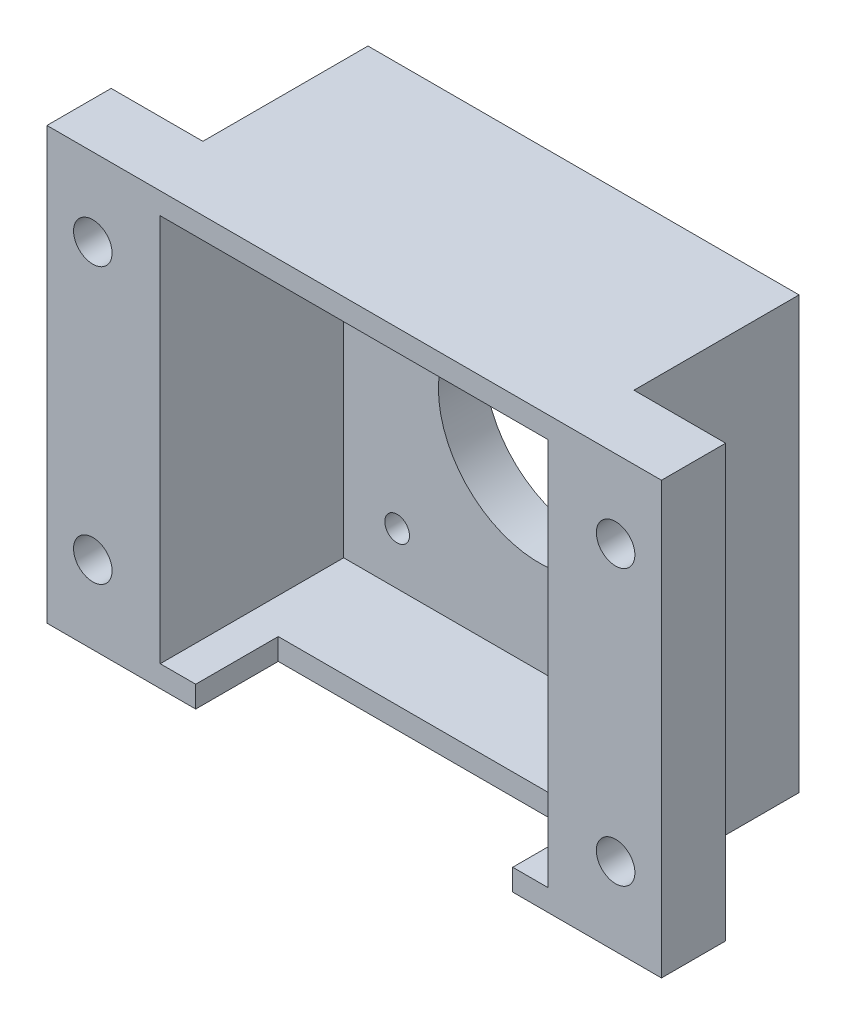
ISO-10303-21;
HEADER;
FILE_DESCRIPTION(('STEP AP214'),'2;1');
FILE_NAME('part.step','',(''),(''),'','','');
FILE_SCHEMA(('AUTOMOTIVE_DESIGN { 1 0 10303 214 1 1 1 1 }'));
ENDSEC;
DATA;
#1=APPLICATION_CONTEXT('core data for automotive mechanical design processes');
#2=APPLICATION_PROTOCOL_DEFINITION('international standard','automotive_design',2000,#1);
#3=PRODUCT_CONTEXT('',#1,'mechanical');
#4=PRODUCT('Part','Part','',(#3));
#5=PRODUCT_RELATED_PRODUCT_CATEGORY('part','',(#4));
#6=PRODUCT_DEFINITION_FORMATION('','',#4);
#7=PRODUCT_DEFINITION_CONTEXT('part definition',#1,'design');
#8=PRODUCT_DEFINITION('design','',#6,#7);
#9=PRODUCT_DEFINITION_SHAPE('','',#8);
#10=(LENGTH_UNIT() NAMED_UNIT(*) SI_UNIT(.MILLI.,.METRE.));
#11=(NAMED_UNIT(*) PLANE_ANGLE_UNIT() SI_UNIT($,.RADIAN.));
#12=(NAMED_UNIT(*) SI_UNIT($,.STERADIAN.) SOLID_ANGLE_UNIT());
#13=UNCERTAINTY_MEASURE_WITH_UNIT(LENGTH_MEASURE(1.E-05),#10,'distance_accuracy_value','');
#14=(GEOMETRIC_REPRESENTATION_CONTEXT(3) GLOBAL_UNCERTAINTY_ASSIGNED_CONTEXT((#13)) GLOBAL_UNIT_ASSIGNED_CONTEXT((#10,
#11,#12)) REPRESENTATION_CONTEXT('',''));
#15=CARTESIAN_POINT('',(0.,0.,0.));
#16=DIRECTION('',(0.,0.,1.));
#17=DIRECTION('',(1.,0.,0.));
#18=AXIS2_PLACEMENT_3D('',#15,#16,#17);
#19=CARTESIAN_POINT('',(23.5,-23.5,53.));
#20=DIRECTION('',(-1.,0.,0.));
#21=DIRECTION('',(0.,0.,1.));
#22=AXIS2_PLACEMENT_3D('',#19,#20,#21);
#23=PLANE('',#22);
#24=DIRECTION('',(0.,0.,-1.));
#25=VECTOR('',#24,1.);
#26=CARTESIAN_POINT('',(23.5,23.5,53.));
#27=LINE('',#26,#25);
#28=CARTESIAN_POINT('',(23.5,23.5,18.));
#29=VERTEX_POINT('',#28);
#30=CARTESIAN_POINT('',(23.5,23.5,0.));
#31=VERTEX_POINT('',#30);
#32=EDGE_CURVE('E50',#29,#31,#27,.T.);
#33=ORIENTED_EDGE('',*,*,#32,.F.);
#34=DIRECTION('',(0.,-1.,0.));
#35=VECTOR('',#34,1.);
#36=CARTESIAN_POINT('',(23.5,23.5,18.));
#37=LINE('',#36,#35);
#38=CARTESIAN_POINT('',(23.5,-23.5,18.));
#39=VERTEX_POINT('',#38);
#40=EDGE_CURVE('E291',#29,#39,#37,.T.);
#41=ORIENTED_EDGE('',*,*,#40,.T.);
#42=DIRECTION('',(0.,0.,-1.));
#43=VECTOR('',#42,1.);
#44=CARTESIAN_POINT('',(23.5,-23.5,53.));
#45=LINE('',#44,#43);
#46=CARTESIAN_POINT('',(23.5,-23.5,0.));
#47=VERTEX_POINT('',#46);
#48=EDGE_CURVE('E247',#39,#47,#45,.T.);
#49=ORIENTED_EDGE('',*,*,#48,.T.);
#50=DIRECTION('',(0.,1.,0.));
#51=VECTOR('',#50,1.);
#52=CARTESIAN_POINT('',(23.5,-23.5,0.));
#53=LINE('',#52,#51);
#54=EDGE_CURVE('E227',#47,#31,#53,.T.);
#55=ORIENTED_EDGE('',*,*,#54,.T.);
#56=EDGE_LOOP('',(#33,#41,#49,#55));
#57=FACE_BOUND('',#56,.T.);
#58=ADVANCED_FACE('F43',(#57),#23,.F.);
#59=CARTESIAN_POINT('',(-23.5,23.5,53.));
#60=DIRECTION('',(0.,-1.,0.));
#61=DIRECTION('',(0.,0.,-1.));
#62=AXIS2_PLACEMENT_3D('',#59,#60,#61);
#63=PLANE('',#62);
#64=DIRECTION('',(0.,0.,-1.));
#65=VECTOR('',#64,1.);
#66=CARTESIAN_POINT('',(-23.5,23.5,53.));
#67=LINE('',#66,#65);
#68=CARTESIAN_POINT('',(-23.5,23.5,18.));
#69=VERTEX_POINT('',#68);
#70=CARTESIAN_POINT('',(-23.5,23.5,0.));
#71=VERTEX_POINT('',#70);
#72=EDGE_CURVE('E251',#69,#71,#67,.T.);
#73=ORIENTED_EDGE('',*,*,#72,.F.);
#74=DIRECTION('',(-1.,0.,0.));
#75=VECTOR('',#74,1.);
#76=CARTESIAN_POINT('',(-23.5,23.5,18.));
#77=LINE('',#76,#75);
#78=CARTESIAN_POINT('',(-33.5,23.5,18.));
#79=VERTEX_POINT('',#78);
#80=EDGE_CURVE('E308',#69,#79,#77,.T.);
#81=ORIENTED_EDGE('',*,*,#80,.T.);
#82=DIRECTION('',(0.,0.,1.));
#83=VECTOR('',#82,1.);
#84=CARTESIAN_POINT('',(-33.5,23.5,18.));
#85=LINE('',#84,#83);
#86=CARTESIAN_POINT('',(-33.5,23.5,25.));
#87=VERTEX_POINT('',#86);
#88=EDGE_CURVE('E309',#79,#87,#85,.T.);
#89=ORIENTED_EDGE('',*,*,#88,.T.);
#90=DIRECTION('',(1.,0.,0.));
#91=VECTOR('',#90,1.);
#92=CARTESIAN_POINT('',(-24.,23.5,25.));
#93=LINE('',#92,#91);
#94=CARTESIAN_POINT('',(33.5,23.5,25.));
#95=VERTEX_POINT('',#94);
#96=EDGE_CURVE('E326',#87,#95,#93,.T.);
#97=ORIENTED_EDGE('',*,*,#96,.T.);
#98=DIRECTION('',(0.,0.,1.));
#99=VECTOR('',#98,1.);
#100=CARTESIAN_POINT('',(33.5,23.5,18.));
#101=LINE('',#100,#99);
#102=CARTESIAN_POINT('',(33.5,23.5,18.));
#103=VERTEX_POINT('',#102);
#104=EDGE_CURVE('E577',#103,#95,#101,.T.);
#105=ORIENTED_EDGE('',*,*,#104,.F.);
#106=DIRECTION('',(-1.,0.,0.));
#107=VECTOR('',#106,1.);
#108=CARTESIAN_POINT('',(23.5,23.5,18.));
#109=LINE('',#108,#107);
#110=EDGE_CURVE('E298',#103,#29,#109,.T.);
#111=ORIENTED_EDGE('',*,*,#110,.T.);
#112=ORIENTED_EDGE('',*,*,#32,.T.);
#113=DIRECTION('',(-1.,0.,0.));
#114=VECTOR('',#113,1.);
#115=CARTESIAN_POINT('',(-23.5,23.5,0.));
#116=LINE('',#115,#114);
#117=EDGE_CURVE('E238',#31,#71,#116,.T.);
#118=ORIENTED_EDGE('',*,*,#117,.T.);
#119=EDGE_LOOP('',(#73,#81,#89,#97,#105,#111,#112,#118));
#120=FACE_BOUND('',#119,.T.);
#121=ADVANCED_FACE('F283',(#120),#63,.F.);
#122=CARTESIAN_POINT('',(-23.5,-23.5,53.));
#123=DIRECTION('',(1.,0.,0.));
#124=DIRECTION('',(0.,0.,-1.));
#125=AXIS2_PLACEMENT_3D('',#122,#123,#124);
#126=PLANE('',#125);
#127=DIRECTION('',(0.,0.,-1.));
#128=VECTOR('',#127,1.);
#129=CARTESIAN_POINT('',(-23.5,-23.5,53.));
#130=LINE('',#129,#128);
#131=CARTESIAN_POINT('',(-23.5,-23.5,18.));
#132=VERTEX_POINT('',#131);
#133=CARTESIAN_POINT('',(-23.5,-23.5,0.));
#134=VERTEX_POINT('',#133);
#135=EDGE_CURVE('E249',#132,#134,#130,.T.);
#136=ORIENTED_EDGE('',*,*,#135,.F.);
#137=DIRECTION('',(0.,1.,0.));
#138=VECTOR('',#137,1.);
#139=CARTESIAN_POINT('',(-23.5,23.5,18.));
#140=LINE('',#139,#138);
#141=EDGE_CURVE('E305',#132,#69,#140,.T.);
#142=ORIENTED_EDGE('',*,*,#141,.T.);
#143=ORIENTED_EDGE('',*,*,#72,.T.);
#144=DIRECTION('',(0.,-1.,0.));
#145=VECTOR('',#144,1.);
#146=CARTESIAN_POINT('',(-23.5,-23.5,0.));
#147=LINE('',#146,#145);
#148=EDGE_CURVE('E241',#71,#134,#147,.T.);
#149=ORIENTED_EDGE('',*,*,#148,.T.);
#150=EDGE_LOOP('',(#136,#142,#143,#149));
#151=FACE_BOUND('',#150,.T.);
#152=ADVANCED_FACE('F288',(#151),#126,.F.);
#153=CARTESIAN_POINT('',(-23.5,-23.5,53.));
#154=DIRECTION('',(0.,1.,0.));
#155=DIRECTION('',(0.,0.,1.));
#156=AXIS2_PLACEMENT_3D('',#153,#154,#155);
#157=PLANE('',#156);
#158=DIRECTION('',(-1.,0.,0.));
#159=VECTOR('',#158,1.);
#160=CARTESIAN_POINT('',(-23.5,-23.5,25.));
#161=LINE('',#160,#159);
#162=CARTESIAN_POINT('',(33.5,-23.5,25.));
#163=VERTEX_POINT('',#162);
#164=CARTESIAN_POINT('',(17.2818011395303,-23.5,25.));
#165=VERTEX_POINT('',#164);
#166=EDGE_CURVE('E175',#163,#165,#161,.T.);
#167=ORIENTED_EDGE('',*,*,#166,.T.);
#168=DIRECTION('',(0.,0.,1.));
#169=VECTOR('',#168,1.);
#170=CARTESIAN_POINT('',(17.2818011395303,-23.5,25.));
#171=LINE('',#170,#169);
#172=CARTESIAN_POINT('',(17.2818011395303,-23.5,16.));
#173=VERTEX_POINT('',#172);
#174=EDGE_CURVE('E157',#173,#165,#171,.T.);
#175=ORIENTED_EDGE('',*,*,#174,.F.);
#176=DIRECTION('',(1.,0.,0.));
#177=VECTOR('',#176,1.);
#178=CARTESIAN_POINT('',(-17.2818011395303,-23.5,16.));
#179=LINE('',#178,#177);
#180=CARTESIAN_POINT('',(-17.2818011395303,-23.5,16.));
#181=VERTEX_POINT('',#180);
#182=EDGE_CURVE('E180',#181,#173,#179,.T.);
#183=ORIENTED_EDGE('',*,*,#182,.F.);
#184=DIRECTION('',(0.,0.,-1.));
#185=VECTOR('',#184,1.);
#186=CARTESIAN_POINT('',(-17.2818011395303,-23.5,25.));
#187=LINE('',#186,#185);
#188=CARTESIAN_POINT('',(-17.2818011395303,-23.5,25.));
#189=VERTEX_POINT('',#188);
#190=EDGE_CURVE('E168',#189,#181,#187,.T.);
#191=ORIENTED_EDGE('',*,*,#190,.F.);
#192=CARTESIAN_POINT('',(-33.5,-23.5,25.));
#193=VERTEX_POINT('',#192);
#194=EDGE_CURVE('E186',#189,#193,#161,.T.);
#195=ORIENTED_EDGE('',*,*,#194,.T.);
#196=DIRECTION('',(0.,0.,1.));
#197=VECTOR('',#196,1.);
#198=CARTESIAN_POINT('',(-33.5,-23.5,18.));
#199=LINE('',#198,#197);
#200=CARTESIAN_POINT('',(-33.5,-23.5,18.));
#201=VERTEX_POINT('',#200);
#202=EDGE_CURVE('E313',#201,#193,#199,.T.);
#203=ORIENTED_EDGE('',*,*,#202,.F.);
#204=DIRECTION('',(1.,0.,0.));
#205=VECTOR('',#204,1.);
#206=CARTESIAN_POINT('',(-23.5,-23.5,18.));
#207=LINE('',#206,#205);
#208=EDGE_CURVE('E317',#201,#132,#207,.T.);
#209=ORIENTED_EDGE('',*,*,#208,.T.);
#210=ORIENTED_EDGE('',*,*,#135,.T.);
#211=DIRECTION('',(1.,0.,0.));
#212=VECTOR('',#211,1.);
#213=CARTESIAN_POINT('',(-23.5,-23.5,0.));
#214=LINE('',#213,#212);
#215=EDGE_CURVE('E244',#134,#47,#214,.T.);
#216=ORIENTED_EDGE('',*,*,#215,.T.);
#217=ORIENTED_EDGE('',*,*,#48,.F.);
#218=DIRECTION('',(1.,0.,0.));
#219=VECTOR('',#218,1.);
#220=CARTESIAN_POINT('',(23.5,-23.5,18.));
#221=LINE('',#220,#219);
#222=CARTESIAN_POINT('',(33.5,-23.5,18.));
#223=VERTEX_POINT('',#222);
#224=EDGE_CURVE('E65',#39,#223,#221,.T.);
#225=ORIENTED_EDGE('',*,*,#224,.T.);
#226=DIRECTION('',(0.,0.,1.));
#227=VECTOR('',#226,1.);
#228=CARTESIAN_POINT('',(33.5,-23.5,18.));
#229=LINE('',#228,#227);
#230=EDGE_CURVE('E183',#223,#163,#229,.T.);
#231=ORIENTED_EDGE('',*,*,#230,.T.);
#232=EDGE_LOOP('',(#167,#175,#183,#191,#195,#203,#209,#210,#216,#217,#225,#231));
#233=FACE_BOUND('',#232,.T.);
#234=ADVANCED_FACE('F182',(#233),#157,.F.);
#235=CARTESIAN_POINT('',(0.,0.,0.));
#236=DIRECTION('',(0.,0.,-1.));
#237=DIRECTION('',(-1.,0.,0.));
#238=AXIS2_PLACEMENT_3D('',#235,#236,#237);
#239=PLANE('',#238);
#240=CARTESIAN_POINT('',(-15.321257734351,-15.4773506253541,0.));
#241=DIRECTION('',(0.,0.,1.));
#242=DIRECTION('',(-1.,0.,0.));
#243=AXIS2_PLACEMENT_3D('',#240,#241,#242);
#244=CIRCLE('',#243,1.35);
#245=CARTESIAN_POINT('',(-16.671257734351,-15.4773506253541,0.));
#246=VERTEX_POINT('',#245);
#247=EDGE_CURVE('E185',#246,#246,#244,.T.);
#248=ORIENTED_EDGE('',*,*,#247,.T.);
#249=EDGE_LOOP('',(#248));
#250=FACE_BOUND('',#249,.T.);
#251=CARTESIAN_POINT('',(15.678742265649,-15.4773506253541,0.));
#252=DIRECTION('',(0.,0.,1.));
#253=DIRECTION('',(1.,0.,0.));
#254=AXIS2_PLACEMENT_3D('',#251,#252,#253);
#255=CIRCLE('',#254,1.35);
#256=CARTESIAN_POINT('',(17.028742265649,-15.4773506253541,0.));
#257=VERTEX_POINT('',#256);
#258=EDGE_CURVE('E195',#257,#257,#255,.T.);
#259=ORIENTED_EDGE('',*,*,#258,.T.);
#260=EDGE_LOOP('',(#259));
#261=FACE_BOUND('',#260,.T.);
#262=CARTESIAN_POINT('',(15.678742265649,15.5226493746459,0.));
#263=DIRECTION('',(0.,0.,1.));
#264=DIRECTION('',(-1.,0.,0.));
#265=AXIS2_PLACEMENT_3D('',#262,#263,#264);
#266=CIRCLE('',#265,1.35);
#267=CARTESIAN_POINT('',(14.328742265649,15.5226493746459,0.));
#268=VERTEX_POINT('',#267);
#269=EDGE_CURVE('E199',#268,#268,#266,.T.);
#270=ORIENTED_EDGE('',*,*,#269,.T.);
#271=EDGE_LOOP('',(#270));
#272=FACE_BOUND('',#271,.T.);
#273=CARTESIAN_POINT('',(-15.321257734351,15.5226493746459,0.));
#274=DIRECTION('',(0.,0.,1.));
#275=DIRECTION('',(1.,0.,0.));
#276=AXIS2_PLACEMENT_3D('',#273,#274,#275);
#277=CIRCLE('',#276,1.35);
#278=CARTESIAN_POINT('',(-13.971257734351,15.5226493746459,0.));
#279=VERTEX_POINT('',#278);
#280=EDGE_CURVE('E203',#279,#279,#277,.T.);
#281=ORIENTED_EDGE('',*,*,#280,.T.);
#282=EDGE_LOOP('',(#281));
#283=FACE_BOUND('',#282,.T.);
#284=CARTESIAN_POINT('',(0.178742265649005,0.0226493746458712,0.));
#285=DIRECTION('',(0.,0.,1.));
#286=DIRECTION('',(1.,0.,0.));
#287=AXIS2_PLACEMENT_3D('',#284,#285,#286);
#288=CIRCLE('',#287,11.);
#289=CARTESIAN_POINT('',(11.178742265649,0.0226493746458712,0.));
#290=VERTEX_POINT('',#289);
#291=EDGE_CURVE('E207',#290,#290,#288,.T.);
#292=ORIENTED_EDGE('',*,*,#291,.T.);
#293=EDGE_LOOP('',(#292));
#294=FACE_BOUND('',#293,.T.);
#295=ORIENTED_EDGE('',*,*,#54,.F.);
#296=ORIENTED_EDGE('',*,*,#215,.F.);
#297=ORIENTED_EDGE('',*,*,#148,.F.);
#298=ORIENTED_EDGE('',*,*,#117,.F.);
#299=EDGE_LOOP('',(#295,#296,#297,#298));
#300=FACE_BOUND('',#299,.T.);
#301=ADVANCED_FACE('F300',(#250,#261,#272,#283,#294,#300),#239,.T.);
#302=CARTESIAN_POINT('',(21.15,-21.15,5.));
#303=DIRECTION('',(1.,0.,0.));
#304=DIRECTION('',(0.,0.,-1.));
#305=AXIS2_PLACEMENT_3D('',#302,#303,#304);
#306=PLANE('',#305);
#307=DIRECTION('',(0.,0.,1.));
#308=VECTOR('',#307,1.);
#309=CARTESIAN_POINT('',(21.15,-21.15,5.));
#310=LINE('',#309,#308);
#311=CARTESIAN_POINT('',(21.15,-21.15,5.));
#312=VERTEX_POINT('',#311);
#313=CARTESIAN_POINT('',(21.15,-21.15,25.));
#314=VERTEX_POINT('',#313);
#315=EDGE_CURVE('E224',#312,#314,#310,.T.);
#316=ORIENTED_EDGE('',*,*,#315,.T.);
#317=DIRECTION('',(0.,1.,0.));
#318=VECTOR('',#317,1.);
#319=CARTESIAN_POINT('',(21.15,-21.15,25.));
#320=LINE('',#319,#318);
#321=CARTESIAN_POINT('',(21.15,21.15,25.));
#322=VERTEX_POINT('',#321);
#323=EDGE_CURVE('E191',#314,#322,#320,.T.);
#324=ORIENTED_EDGE('',*,*,#323,.T.);
#325=DIRECTION('',(0.,0.,1.));
#326=VECTOR('',#325,1.);
#327=CARTESIAN_POINT('',(21.15,21.15,5.));
#328=LINE('',#327,#326);
#329=CARTESIAN_POINT('',(21.15,21.15,5.));
#330=VERTEX_POINT('',#329);
#331=EDGE_CURVE('E223',#330,#322,#328,.T.);
#332=ORIENTED_EDGE('',*,*,#331,.F.);
#333=DIRECTION('',(0.,1.,0.));
#334=VECTOR('',#333,1.);
#335=CARTESIAN_POINT('',(21.15,-21.15,5.));
#336=LINE('',#335,#334);
#337=EDGE_CURVE('E211',#312,#330,#336,.T.);
#338=ORIENTED_EDGE('',*,*,#337,.F.);
#339=EDGE_LOOP('',(#316,#324,#332,#338));
#340=FACE_BOUND('',#339,.T.);
#341=ADVANCED_FACE('F341',(#340),#306,.F.);
#342=CARTESIAN_POINT('',(-21.15,-21.15,5.));
#343=DIRECTION('',(0.,-1.,0.));
#344=DIRECTION('',(0.,0.,-1.));
#345=AXIS2_PLACEMENT_3D('',#342,#343,#344);
#346=PLANE('',#345);
#347=DIRECTION('',(-1.,0.,0.));
#348=VECTOR('',#347,1.);
#349=CARTESIAN_POINT('',(-17.2818011395303,-21.15,16.));
#350=LINE('',#349,#348);
#351=CARTESIAN_POINT('',(17.2818011395303,-21.15,16.));
#352=VERTEX_POINT('',#351);
#353=CARTESIAN_POINT('',(-17.2818011395303,-21.15,16.));
#354=VERTEX_POINT('',#353);
#355=EDGE_CURVE('E568',#352,#354,#350,.T.);
#356=ORIENTED_EDGE('',*,*,#355,.F.);
#357=DIRECTION('',(0.,0.,-1.));
#358=VECTOR('',#357,1.);
#359=CARTESIAN_POINT('',(17.2818011395303,-21.15,25.));
#360=LINE('',#359,#358);
#361=CARTESIAN_POINT('',(17.2818011395303,-21.15,25.));
#362=VERTEX_POINT('',#361);
#363=EDGE_CURVE('E339',#362,#352,#360,.T.);
#364=ORIENTED_EDGE('',*,*,#363,.F.);
#365=DIRECTION('',(1.,0.,0.));
#366=VECTOR('',#365,1.);
#367=CARTESIAN_POINT('',(-21.15,-21.15,25.));
#368=LINE('',#367,#366);
#369=EDGE_CURVE('E178',#362,#314,#368,.T.);
#370=ORIENTED_EDGE('',*,*,#369,.T.);
#371=ORIENTED_EDGE('',*,*,#315,.F.);
#372=DIRECTION('',(1.,0.,0.));
#373=VECTOR('',#372,1.);
#374=CARTESIAN_POINT('',(-21.15,-21.15,5.));
#375=LINE('',#374,#373);
#376=CARTESIAN_POINT('',(-21.15,-21.15,5.));
#377=VERTEX_POINT('',#376);
#378=EDGE_CURVE('E220',#377,#312,#375,.T.);
#379=ORIENTED_EDGE('',*,*,#378,.F.);
#380=DIRECTION('',(0.,0.,1.));
#381=VECTOR('',#380,1.);
#382=CARTESIAN_POINT('',(-21.15,-21.15,5.));
#383=LINE('',#382,#381);
#384=CARTESIAN_POINT('',(-21.15,-21.15,25.));
#385=VERTEX_POINT('',#384);
#386=EDGE_CURVE('E228',#377,#385,#383,.T.);
#387=ORIENTED_EDGE('',*,*,#386,.T.);
#388=CARTESIAN_POINT('',(-17.2818011395303,-21.15,25.));
#389=VERTEX_POINT('',#388);
#390=EDGE_CURVE('E331',#385,#389,#368,.T.);
#391=ORIENTED_EDGE('',*,*,#390,.T.);
#392=DIRECTION('',(0.,0.,1.));
#393=VECTOR('',#392,1.);
#394=CARTESIAN_POINT('',(-17.2818011395303,-21.15,25.));
#395=LINE('',#394,#393);
#396=EDGE_CURVE('E57',#354,#389,#395,.T.);
#397=ORIENTED_EDGE('',*,*,#396,.F.);
#398=EDGE_LOOP('',(#356,#364,#370,#371,#379,#387,#391,#397));
#399=FACE_BOUND('',#398,.T.);
#400=ADVANCED_FACE('F336',(#399),#346,.F.);
#401=CARTESIAN_POINT('',(-21.15,-21.15,5.));
#402=DIRECTION('',(-1.,0.,0.));
#403=DIRECTION('',(0.,0.,1.));
#404=AXIS2_PLACEMENT_3D('',#401,#402,#403);
#405=PLANE('',#404);
#406=DIRECTION('',(0.,0.,1.));
#407=VECTOR('',#406,1.);
#408=CARTESIAN_POINT('',(-21.15,21.15,5.));
#409=LINE('',#408,#407);
#410=CARTESIAN_POINT('',(-21.15,21.15,5.));
#411=VERTEX_POINT('',#410);
#412=CARTESIAN_POINT('',(-21.15,21.15,25.));
#413=VERTEX_POINT('',#412);
#414=EDGE_CURVE('E231',#411,#413,#409,.T.);
#415=ORIENTED_EDGE('',*,*,#414,.T.);
#416=DIRECTION('',(0.,-1.,0.));
#417=VECTOR('',#416,1.);
#418=CARTESIAN_POINT('',(-21.15,-21.15,25.));
#419=LINE('',#418,#417);
#420=EDGE_CURVE('E329',#413,#385,#419,.T.);
#421=ORIENTED_EDGE('',*,*,#420,.T.);
#422=ORIENTED_EDGE('',*,*,#386,.F.);
#423=DIRECTION('',(0.,-1.,0.));
#424=VECTOR('',#423,1.);
#425=CARTESIAN_POINT('',(-21.15,-21.15,5.));
#426=LINE('',#425,#424);
#427=EDGE_CURVE('E217',#411,#377,#426,.T.);
#428=ORIENTED_EDGE('',*,*,#427,.F.);
#429=EDGE_LOOP('',(#415,#421,#422,#428));
#430=FACE_BOUND('',#429,.T.);
#431=ADVANCED_FACE('F346',(#430),#405,.F.);
#432=CARTESIAN_POINT('',(-21.15,21.15,5.));
#433=DIRECTION('',(0.,1.,0.));
#434=DIRECTION('',(0.,0.,1.));
#435=AXIS2_PLACEMENT_3D('',#432,#433,#434);
#436=PLANE('',#435);
#437=ORIENTED_EDGE('',*,*,#331,.T.);
#438=DIRECTION('',(-1.,0.,0.));
#439=VECTOR('',#438,1.);
#440=CARTESIAN_POINT('',(-21.15,21.15,25.));
#441=LINE('',#440,#439);
#442=EDGE_CURVE('E11',#322,#413,#441,.T.);
#443=ORIENTED_EDGE('',*,*,#442,.T.);
#444=ORIENTED_EDGE('',*,*,#414,.F.);
#445=DIRECTION('',(-1.,0.,0.));
#446=VECTOR('',#445,1.);
#447=CARTESIAN_POINT('',(-21.15,21.15,5.));
#448=LINE('',#447,#446);
#449=EDGE_CURVE('E214',#330,#411,#448,.T.);
#450=ORIENTED_EDGE('',*,*,#449,.F.);
#451=EDGE_LOOP('',(#437,#443,#444,#450));
#452=FACE_BOUND('',#451,.T.);
#453=ADVANCED_FACE('F348',(#452),#436,.F.);
#454=CARTESIAN_POINT('',(0.,0.,5.));
#455=DIRECTION('',(0.,0.,-1.));
#456=DIRECTION('',(-1.,0.,0.));
#457=AXIS2_PLACEMENT_3D('',#454,#455,#456);
#458=PLANE('',#457);
#459=CARTESIAN_POINT('',(-15.321257734351,-15.4773506253541,5.));
#460=DIRECTION('',(0.,0.,-1.));
#461=DIRECTION('',(-1.,0.,0.));
#462=AXIS2_PLACEMENT_3D('',#459,#460,#461);
#463=CIRCLE('',#462,1.35);
#464=CARTESIAN_POINT('',(-16.671257734351,-15.4773506253541,5.));
#465=VERTEX_POINT('',#464);
#466=EDGE_CURVE('E189',#465,#465,#463,.T.);
#467=ORIENTED_EDGE('',*,*,#466,.T.);
#468=EDGE_LOOP('',(#467));
#469=FACE_BOUND('',#468,.T.);
#470=CARTESIAN_POINT('',(15.678742265649,-15.4773506253541,5.));
#471=DIRECTION('',(0.,0.,-1.));
#472=DIRECTION('',(-1.,0.,0.));
#473=AXIS2_PLACEMENT_3D('',#470,#471,#472);
#474=CIRCLE('',#473,1.35);
#475=CARTESIAN_POINT('',(14.328742265649,-15.4773506253541,5.));
#476=VERTEX_POINT('',#475);
#477=EDGE_CURVE('E198',#476,#476,#474,.T.);
#478=ORIENTED_EDGE('',*,*,#477,.T.);
#479=EDGE_LOOP('',(#478));
#480=FACE_BOUND('',#479,.T.);
#481=CARTESIAN_POINT('',(15.678742265649,15.5226493746459,5.));
#482=DIRECTION('',(0.,0.,-1.));
#483=DIRECTION('',(-1.,0.,0.));
#484=AXIS2_PLACEMENT_3D('',#481,#482,#483);
#485=CIRCLE('',#484,1.35);
#486=CARTESIAN_POINT('',(14.328742265649,15.5226493746459,5.));
#487=VERTEX_POINT('',#486);
#488=EDGE_CURVE('E202',#487,#487,#485,.T.);
#489=ORIENTED_EDGE('',*,*,#488,.T.);
#490=EDGE_LOOP('',(#489));
#491=FACE_BOUND('',#490,.T.);
#492=CARTESIAN_POINT('',(-15.321257734351,15.5226493746459,5.));
#493=DIRECTION('',(0.,0.,-1.));
#494=DIRECTION('',(-1.,0.,0.));
#495=AXIS2_PLACEMENT_3D('',#492,#493,#494);
#496=CIRCLE('',#495,1.35);
#497=CARTESIAN_POINT('',(-16.671257734351,15.5226493746459,5.));
#498=VERTEX_POINT('',#497);
#499=EDGE_CURVE('E206',#498,#498,#496,.T.);
#500=ORIENTED_EDGE('',*,*,#499,.T.);
#501=EDGE_LOOP('',(#500));
#502=FACE_BOUND('',#501,.T.);
#503=CARTESIAN_POINT('',(0.178742265649005,0.0226493746458712,5.));
#504=DIRECTION('',(0.,0.,-1.));
#505=DIRECTION('',(-1.,0.,0.));
#506=AXIS2_PLACEMENT_3D('',#503,#504,#505);
#507=CIRCLE('',#506,11.);
#508=CARTESIAN_POINT('',(-10.821257734351,0.0226493746458712,5.));
#509=VERTEX_POINT('',#508);
#510=EDGE_CURVE('E210',#509,#509,#507,.T.);
#511=ORIENTED_EDGE('',*,*,#510,.T.);
#512=EDGE_LOOP('',(#511));
#513=FACE_BOUND('',#512,.T.);
#514=ORIENTED_EDGE('',*,*,#337,.T.);
#515=ORIENTED_EDGE('',*,*,#449,.T.);
#516=ORIENTED_EDGE('',*,*,#427,.T.);
#517=ORIENTED_EDGE('',*,*,#378,.T.);
#518=EDGE_LOOP('',(#514,#515,#516,#517));
#519=FACE_BOUND('',#518,.T.);
#520=ADVANCED_FACE('F264',(#469,#480,#491,#502,#513,#519),#458,.F.);
#521=CARTESIAN_POINT('',(0.178742265649005,0.0226493746458712,0.));
#522=DIRECTION('',(0.,0.,1.));
#523=DIRECTION('',(1.,0.,0.));
#524=AXIS2_PLACEMENT_3D('',#521,#522,#523);
#525=CYLINDRICAL_SURFACE('',#524,11.);
#526=ORIENTED_EDGE('',*,*,#291,.F.);
#527=EDGE_LOOP('',(#526));
#528=FACE_BOUND('',#527,.T.);
#529=ORIENTED_EDGE('',*,*,#510,.F.);
#530=EDGE_LOOP('',(#529));
#531=FACE_BOUND('',#530,.T.);
#532=ADVANCED_FACE('F355',(#528,#531),#525,.F.);
#533=CARTESIAN_POINT('',(-15.321257734351,15.5226493746459,0.));
#534=DIRECTION('',(0.,0.,1.));
#535=DIRECTION('',(1.,0.,0.));
#536=AXIS2_PLACEMENT_3D('',#533,#534,#535);
#537=CYLINDRICAL_SURFACE('',#536,1.35);
#538=ORIENTED_EDGE('',*,*,#280,.F.);
#539=EDGE_LOOP('',(#538));
#540=FACE_BOUND('',#539,.T.);
#541=ORIENTED_EDGE('',*,*,#499,.F.);
#542=EDGE_LOOP('',(#541));
#543=FACE_BOUND('',#542,.T.);
#544=ADVANCED_FACE('F657',(#540,#543),#537,.F.);
#545=CARTESIAN_POINT('',(15.678742265649,15.5226493746459,0.));
#546=DIRECTION('',(0.,0.,1.));
#547=DIRECTION('',(1.,0.,0.));
#548=AXIS2_PLACEMENT_3D('',#545,#546,#547);
#549=CYLINDRICAL_SURFACE('',#548,1.35);
#550=ORIENTED_EDGE('',*,*,#269,.F.);
#551=EDGE_LOOP('',(#550));
#552=FACE_BOUND('',#551,.T.);
#553=ORIENTED_EDGE('',*,*,#488,.F.);
#554=EDGE_LOOP('',(#553));
#555=FACE_BOUND('',#554,.T.);
#556=ADVANCED_FACE('F278',(#552,#555),#549,.F.);
#557=CARTESIAN_POINT('',(15.678742265649,-15.4773506253541,0.));
#558=DIRECTION('',(0.,0.,1.));
#559=DIRECTION('',(1.,0.,0.));
#560=AXIS2_PLACEMENT_3D('',#557,#558,#559);
#561=CYLINDRICAL_SURFACE('',#560,1.35);
#562=ORIENTED_EDGE('',*,*,#258,.F.);
#563=EDGE_LOOP('',(#562));
#564=FACE_BOUND('',#563,.T.);
#565=ORIENTED_EDGE('',*,*,#477,.F.);
#566=EDGE_LOOP('',(#565));
#567=FACE_BOUND('',#566,.T.);
#568=ADVANCED_FACE('F269',(#564,#567),#561,.F.);
#569=CARTESIAN_POINT('',(-15.321257734351,-15.4773506253541,0.));
#570=DIRECTION('',(0.,0.,1.));
#571=DIRECTION('',(1.,0.,0.));
#572=AXIS2_PLACEMENT_3D('',#569,#570,#571);
#573=CYLINDRICAL_SURFACE('',#572,1.35);
#574=ORIENTED_EDGE('',*,*,#247,.F.);
#575=EDGE_LOOP('',(#574));
#576=FACE_BOUND('',#575,.T.);
#577=ORIENTED_EDGE('',*,*,#466,.F.);
#578=EDGE_LOOP('',(#577));
#579=FACE_BOUND('',#578,.T.);
#580=ADVANCED_FACE('F267',(#576,#579),#573,.F.);
#581=CARTESIAN_POINT('',(-24.,23.5,25.));
#582=DIRECTION('',(0.,0.,-1.));
#583=DIRECTION('',(-1.,0.,0.));
#584=AXIS2_PLACEMENT_3D('',#581,#582,#583);
#585=PLANE('',#584);
#586=ORIENTED_EDGE('',*,*,#369,.F.);
#587=DIRECTION('',(0.,-1.,0.));
#588=VECTOR('',#587,1.);
#589=CARTESIAN_POINT('',(17.2818011395303,14.566139244116,25.));
#590=LINE('',#589,#588);
#591=EDGE_CURVE('E160',#362,#165,#590,.T.);
#592=ORIENTED_EDGE('',*,*,#591,.T.);
#593=ORIENTED_EDGE('',*,*,#166,.F.);
#594=DIRECTION('',(0.,1.,0.));
#595=VECTOR('',#594,1.);
#596=CARTESIAN_POINT('',(33.5,-23.5,25.));
#597=LINE('',#596,#595);
#598=EDGE_CURVE('E585',#163,#95,#597,.T.);
#599=ORIENTED_EDGE('',*,*,#598,.T.);
#600=ORIENTED_EDGE('',*,*,#96,.F.);
#601=DIRECTION('',(0.,-1.,0.));
#602=VECTOR('',#601,1.);
#603=CARTESIAN_POINT('',(-33.5,-23.5,25.));
#604=LINE('',#603,#602);
#605=EDGE_CURVE('E321',#87,#193,#604,.T.);
#606=ORIENTED_EDGE('',*,*,#605,.T.);
#607=ORIENTED_EDGE('',*,*,#194,.F.);
#608=DIRECTION('',(0.,-1.,0.));
#609=VECTOR('',#608,1.);
#610=CARTESIAN_POINT('',(-17.2818011395303,14.566139244116,25.));
#611=LINE('',#610,#609);
#612=EDGE_CURVE('E179',#389,#189,#611,.T.);
#613=ORIENTED_EDGE('',*,*,#612,.F.);
#614=ORIENTED_EDGE('',*,*,#390,.F.);
#615=ORIENTED_EDGE('',*,*,#420,.F.);
#616=ORIENTED_EDGE('',*,*,#442,.F.);
#617=ORIENTED_EDGE('',*,*,#323,.F.);
#618=EDGE_LOOP('',(#586,#592,#593,#599,#600,#606,#607,#613,#614,#615,#616,#617));
#619=FACE_BOUND('',#618,.T.);
#620=CARTESIAN_POINT('',(-28.5,-14.9999999999961,25.));
#621=DIRECTION('',(0.,0.,1.));
#622=DIRECTION('',(-1.,0.,0.));
#623=AXIS2_PLACEMENT_3D('',#620,#621,#622);
#624=CIRCLE('',#623,2.09999999999495);
#625=CARTESIAN_POINT('',(-30.599999999995,-14.9999999999961,25.));
#626=VERTEX_POINT('',#625);
#627=EDGE_CURVE('E603',#626,#626,#624,.T.);
#628=ORIENTED_EDGE('',*,*,#627,.F.);
#629=EDGE_LOOP('',(#628));
#630=FACE_BOUND('',#629,.T.);
#631=CARTESIAN_POINT('',(-28.5,14.9999999999961,25.));
#632=DIRECTION('',(0.,0.,1.));
#633=DIRECTION('',(1.,0.,0.));
#634=AXIS2_PLACEMENT_3D('',#631,#632,#633);
#635=CIRCLE('',#634,2.09999999999723);
#636=CARTESIAN_POINT('',(-26.4000000000028,14.9999999999961,25.));
#637=VERTEX_POINT('',#636);
#638=EDGE_CURVE('E609',#637,#637,#635,.T.);
#639=ORIENTED_EDGE('',*,*,#638,.F.);
#640=EDGE_LOOP('',(#639));
#641=FACE_BOUND('',#640,.T.);
#642=CARTESIAN_POINT('',(28.5,14.9999999999961,25.));
#643=DIRECTION('',(0.,0.,1.));
#644=DIRECTION('',(-1.,0.,0.));
#645=AXIS2_PLACEMENT_3D('',#642,#643,#644);
#646=CIRCLE('',#645,2.10000000000505);
#647=CARTESIAN_POINT('',(26.399999999995,14.9999999999961,25.));
#648=VERTEX_POINT('',#647);
#649=EDGE_CURVE('E600',#648,#648,#646,.T.);
#650=ORIENTED_EDGE('',*,*,#649,.F.);
#651=EDGE_LOOP('',(#650));
#652=FACE_BOUND('',#651,.T.);
#653=CARTESIAN_POINT('',(28.5,-14.9999999999961,25.));
#654=DIRECTION('',(0.,0.,1.));
#655=DIRECTION('',(1.,0.,0.));
#656=AXIS2_PLACEMENT_3D('',#653,#654,#655);
#657=CIRCLE('',#656,2.10000000000277);
#658=CARTESIAN_POINT('',(30.6000000000028,-14.9999999999961,25.));
#659=VERTEX_POINT('',#658);
#660=EDGE_CURVE('E594',#659,#659,#657,.T.);
#661=ORIENTED_EDGE('',*,*,#660,.F.);
#662=EDGE_LOOP('',(#661));
#663=FACE_BOUND('',#662,.T.);
#664=ADVANCED_FACE('F172',(#619,#630,#641,#652,#663),#585,.F.);
#665=CARTESIAN_POINT('',(-33.5,-23.5,18.));
#666=DIRECTION('',(-1.,0.,0.));
#667=DIRECTION('',(0.,0.,1.));
#668=AXIS2_PLACEMENT_3D('',#665,#666,#667);
#669=PLANE('',#668);
#670=ORIENTED_EDGE('',*,*,#605,.F.);
#671=ORIENTED_EDGE('',*,*,#88,.F.);
#672=DIRECTION('',(0.,-1.,0.));
#673=VECTOR('',#672,1.);
#674=CARTESIAN_POINT('',(-33.5,-23.5,18.));
#675=LINE('',#674,#673);
#676=EDGE_CURVE('E324',#79,#201,#675,.T.);
#677=ORIENTED_EDGE('',*,*,#676,.T.);
#678=ORIENTED_EDGE('',*,*,#202,.T.);
#679=EDGE_LOOP('',(#670,#671,#677,#678));
#680=FACE_BOUND('',#679,.T.);
#681=ADVANCED_FACE('F276',(#680),#669,.T.);
#682=CARTESIAN_POINT('',(0.,0.,18.));
#683=DIRECTION('',(0.,0.,1.));
#684=DIRECTION('',(1.,0.,0.));
#685=AXIS2_PLACEMENT_3D('',#682,#683,#684);
#686=PLANE('',#685);
#687=CARTESIAN_POINT('',(-28.5,-14.9999999999961,18.));
#688=DIRECTION('',(0.,0.,1.));
#689=DIRECTION('',(-1.,0.,0.));
#690=AXIS2_PLACEMENT_3D('',#687,#688,#689);
#691=CIRCLE('',#690,2.09999999999495);
#692=CARTESIAN_POINT('',(-30.599999999995,-14.9999999999961,18.));
#693=VERTEX_POINT('',#692);
#694=EDGE_CURVE('E606',#693,#693,#691,.T.);
#695=ORIENTED_EDGE('',*,*,#694,.T.);
#696=EDGE_LOOP('',(#695));
#697=FACE_BOUND('',#696,.T.);
#698=CARTESIAN_POINT('',(-28.5,14.9999999999961,18.));
#699=DIRECTION('',(0.,0.,1.));
#700=DIRECTION('',(1.,0.,0.));
#701=AXIS2_PLACEMENT_3D('',#698,#699,#700);
#702=CIRCLE('',#701,2.09999999999723);
#703=CARTESIAN_POINT('',(-26.4000000000028,14.9999999999961,18.));
#704=VERTEX_POINT('',#703);
#705=EDGE_CURVE('E325',#704,#704,#702,.T.);
#706=ORIENTED_EDGE('',*,*,#705,.T.);
#707=EDGE_LOOP('',(#706));
#708=FACE_BOUND('',#707,.T.);
#709=ORIENTED_EDGE('',*,*,#676,.F.);
#710=ORIENTED_EDGE('',*,*,#80,.F.);
#711=ORIENTED_EDGE('',*,*,#141,.F.);
#712=ORIENTED_EDGE('',*,*,#208,.F.);
#713=EDGE_LOOP('',(#709,#710,#711,#712));
#714=FACE_BOUND('',#713,.T.);
#715=ADVANCED_FACE('F448',(#697,#708,#714),#686,.F.);
#716=CARTESIAN_POINT('',(-28.5,14.9999999999961,18.));
#717=DIRECTION('',(0.,0.,1.));
#718=DIRECTION('',(1.,0.,0.));
#719=AXIS2_PLACEMENT_3D('',#716,#717,#718);
#720=CYLINDRICAL_SURFACE('',#719,2.09999999999723);
#721=ORIENTED_EDGE('',*,*,#705,.F.);
#722=EDGE_LOOP('',(#721));
#723=FACE_BOUND('',#722,.T.);
#724=ORIENTED_EDGE('',*,*,#638,.T.);
#725=EDGE_LOOP('',(#724));
#726=FACE_BOUND('',#725,.T.);
#727=ADVANCED_FACE('F459',(#723,#726),#720,.F.);
#728=CARTESIAN_POINT('',(-28.5,-14.9999999999961,18.));
#729=DIRECTION('',(0.,0.,1.));
#730=DIRECTION('',(1.,0.,0.));
#731=AXIS2_PLACEMENT_3D('',#728,#729,#730);
#732=CYLINDRICAL_SURFACE('',#731,2.09999999999495);
#733=ORIENTED_EDGE('',*,*,#694,.F.);
#734=EDGE_LOOP('',(#733));
#735=FACE_BOUND('',#734,.T.);
#736=ORIENTED_EDGE('',*,*,#627,.T.);
#737=EDGE_LOOP('',(#736));
#738=FACE_BOUND('',#737,.T.);
#739=ADVANCED_FACE('F470',(#735,#738),#732,.F.);
#740=CARTESIAN_POINT('',(33.5,-23.5,18.));
#741=DIRECTION('',(1.,0.,0.));
#742=DIRECTION('',(0.,0.,-1.));
#743=AXIS2_PLACEMENT_3D('',#740,#741,#742);
#744=PLANE('',#743);
#745=ORIENTED_EDGE('',*,*,#598,.F.);
#746=ORIENTED_EDGE('',*,*,#230,.F.);
#747=DIRECTION('',(0.,1.,0.));
#748=VECTOR('',#747,1.);
#749=CARTESIAN_POINT('',(33.5,-23.5,18.));
#750=LINE('',#749,#748);
#751=EDGE_CURVE('E590',#223,#103,#750,.T.);
#752=ORIENTED_EDGE('',*,*,#751,.T.);
#753=ORIENTED_EDGE('',*,*,#104,.T.);
#754=EDGE_LOOP('',(#745,#746,#752,#753));
#755=FACE_BOUND('',#754,.T.);
#756=ADVANCED_FACE('F481',(#755),#744,.T.);
#757=CARTESIAN_POINT('',(0.,0.,18.));
#758=DIRECTION('',(0.,0.,1.));
#759=DIRECTION('',(1.,0.,0.));
#760=AXIS2_PLACEMENT_3D('',#757,#758,#759);
#761=PLANE('',#760);
#762=CARTESIAN_POINT('',(28.5,14.9999999999961,18.));
#763=DIRECTION('',(0.,0.,1.));
#764=DIRECTION('',(-1.,0.,0.));
#765=AXIS2_PLACEMENT_3D('',#762,#763,#764);
#766=CIRCLE('',#765,2.10000000000505);
#767=CARTESIAN_POINT('',(26.399999999995,14.9999999999961,18.));
#768=VERTEX_POINT('',#767);
#769=EDGE_CURVE('E597',#768,#768,#766,.T.);
#770=ORIENTED_EDGE('',*,*,#769,.T.);
#771=EDGE_LOOP('',(#770));
#772=FACE_BOUND('',#771,.T.);
#773=CARTESIAN_POINT('',(28.5,-14.9999999999961,18.));
#774=DIRECTION('',(0.,0.,1.));
#775=DIRECTION('',(1.,0.,0.));
#776=AXIS2_PLACEMENT_3D('',#773,#774,#775);
#777=CIRCLE('',#776,2.10000000000277);
#778=CARTESIAN_POINT('',(30.6000000000028,-14.9999999999961,18.));
#779=VERTEX_POINT('',#778);
#780=EDGE_CURVE('E587',#779,#779,#777,.T.);
#781=ORIENTED_EDGE('',*,*,#780,.T.);
#782=EDGE_LOOP('',(#781));
#783=FACE_BOUND('',#782,.T.);
#784=ORIENTED_EDGE('',*,*,#224,.F.);
#785=ORIENTED_EDGE('',*,*,#40,.F.);
#786=ORIENTED_EDGE('',*,*,#110,.F.);
#787=ORIENTED_EDGE('',*,*,#751,.F.);
#788=EDGE_LOOP('',(#784,#785,#786,#787));
#789=FACE_BOUND('',#788,.T.);
#790=ADVANCED_FACE('F492',(#772,#783,#789),#761,.F.);
#791=CARTESIAN_POINT('',(28.5,-14.9999999999961,18.));
#792=DIRECTION('',(0.,0.,1.));
#793=DIRECTION('',(1.,0.,0.));
#794=AXIS2_PLACEMENT_3D('',#791,#792,#793);
#795=CYLINDRICAL_SURFACE('',#794,2.10000000000277);
#796=ORIENTED_EDGE('',*,*,#780,.F.);
#797=EDGE_LOOP('',(#796));
#798=FACE_BOUND('',#797,.T.);
#799=ORIENTED_EDGE('',*,*,#660,.T.);
#800=EDGE_LOOP('',(#799));
#801=FACE_BOUND('',#800,.T.);
#802=ADVANCED_FACE('F503',(#798,#801),#795,.F.);
#803=CARTESIAN_POINT('',(28.5,14.9999999999961,18.));
#804=DIRECTION('',(0.,0.,1.));
#805=DIRECTION('',(1.,0.,0.));
#806=AXIS2_PLACEMENT_3D('',#803,#804,#805);
#807=CYLINDRICAL_SURFACE('',#806,2.10000000000505);
#808=ORIENTED_EDGE('',*,*,#769,.F.);
#809=EDGE_LOOP('',(#808));
#810=FACE_BOUND('',#809,.T.);
#811=ORIENTED_EDGE('',*,*,#649,.T.);
#812=EDGE_LOOP('',(#811));
#813=FACE_BOUND('',#812,.T.);
#814=ADVANCED_FACE('F514',(#810,#813),#807,.F.);
#815=CARTESIAN_POINT('',(17.2818011395303,14.566139244116,25.));
#816=DIRECTION('',(1.,0.,0.));
#817=DIRECTION('',(0.,0.,-1.));
#818=AXIS2_PLACEMENT_3D('',#815,#816,#817);
#819=PLANE('',#818);
#820=ORIENTED_EDGE('',*,*,#363,.T.);
#821=DIRECTION('',(0.,-1.,0.));
#822=VECTOR('',#821,1.);
#823=CARTESIAN_POINT('',(17.2818011395303,14.566139244116,16.));
#824=LINE('',#823,#822);
#825=EDGE_CURVE('E163',#352,#173,#824,.T.);
#826=ORIENTED_EDGE('',*,*,#825,.T.);
#827=ORIENTED_EDGE('',*,*,#174,.T.);
#828=ORIENTED_EDGE('',*,*,#591,.F.);
#829=EDGE_LOOP('',(#820,#826,#827,#828));
#830=FACE_BOUND('',#829,.T.);
#831=ADVANCED_FACE('F159',(#830),#819,.F.);
#832=CARTESIAN_POINT('',(-17.2818011395303,14.566139244116,16.));
#833=DIRECTION('',(0.,0.,-1.));
#834=DIRECTION('',(-1.,0.,0.));
#835=AXIS2_PLACEMENT_3D('',#832,#833,#834);
#836=PLANE('',#835);
#837=ORIENTED_EDGE('',*,*,#355,.T.);
#838=DIRECTION('',(0.,-1.,0.));
#839=VECTOR('',#838,1.);
#840=CARTESIAN_POINT('',(-17.2818011395303,14.566139244116,16.));
#841=LINE('',#840,#839);
#842=EDGE_CURVE('E569',#354,#181,#841,.T.);
#843=ORIENTED_EDGE('',*,*,#842,.T.);
#844=ORIENTED_EDGE('',*,*,#182,.T.);
#845=ORIENTED_EDGE('',*,*,#825,.F.);
#846=EDGE_LOOP('',(#837,#843,#844,#845));
#847=FACE_BOUND('',#846,.T.);
#848=ADVANCED_FACE('F533',(#847),#836,.F.);
#849=CARTESIAN_POINT('',(-17.2818011395303,14.566139244116,25.));
#850=DIRECTION('',(-1.,0.,0.));
#851=DIRECTION('',(0.,0.,1.));
#852=AXIS2_PLACEMENT_3D('',#849,#850,#851);
#853=PLANE('',#852);
#854=ORIENTED_EDGE('',*,*,#396,.T.);
#855=ORIENTED_EDGE('',*,*,#612,.T.);
#856=ORIENTED_EDGE('',*,*,#190,.T.);
#857=ORIENTED_EDGE('',*,*,#842,.F.);
#858=EDGE_LOOP('',(#854,#855,#856,#857));
#859=FACE_BOUND('',#858,.T.);
#860=ADVANCED_FACE('F543',(#859),#853,.F.);
#861=CLOSED_SHELL('',(#58,#121,#152,#234,#301,#341,#400,#431,#453,#520,#532,#544,#556,#568,#580,
#664,#681,#715,#727,#739,#756,#790,#802,#814,#831,#848,#860));
#862=MANIFOLD_SOLID_BREP('B2',#861);
#863=ADVANCED_BREP_SHAPE_REPRESENTATION('',(#18,#862),#14);
#864=SHAPE_DEFINITION_REPRESENTATION(#9,#863);
ENDSEC;
END-ISO-10303-21;
